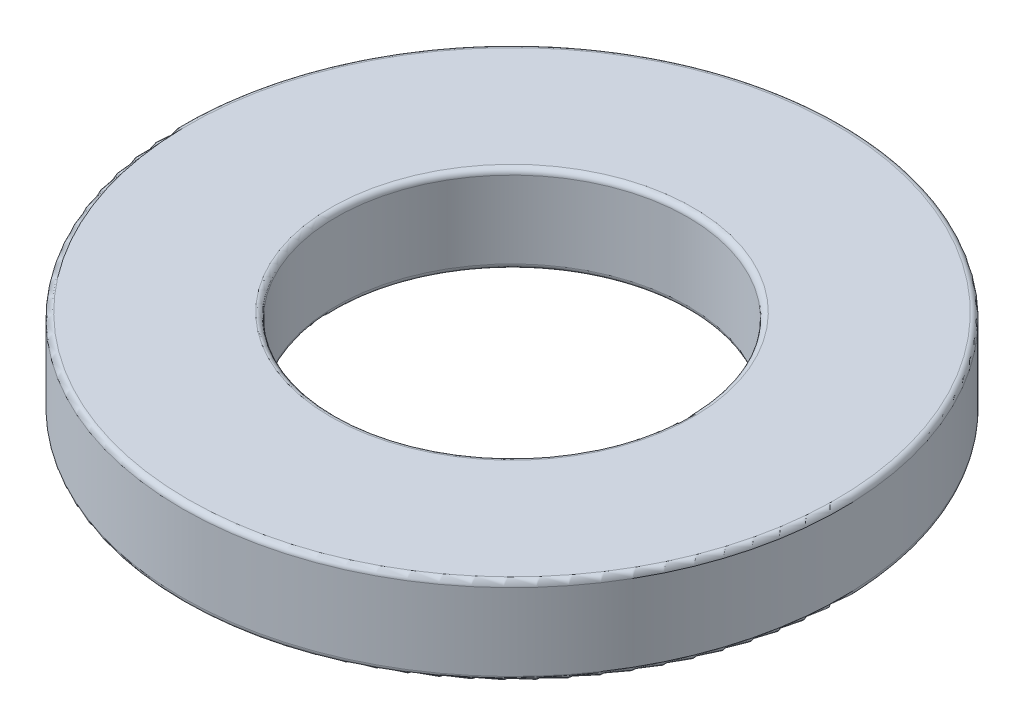
ISO-10303-21;
HEADER;
FILE_DESCRIPTION(('STEP AP214'),'2;1');
FILE_NAME('part.step','',(''),(''),'','','');
FILE_SCHEMA(('AUTOMOTIVE_DESIGN { 1 0 10303 214 1 1 1 1 }'));
ENDSEC;
DATA;
#1=APPLICATION_CONTEXT('core data for automotive mechanical design processes');
#2=APPLICATION_PROTOCOL_DEFINITION('international standard','automotive_design',2000,#1);
#3=PRODUCT_CONTEXT('',#1,'mechanical');
#4=PRODUCT('Part','Part','',(#3));
#5=PRODUCT_RELATED_PRODUCT_CATEGORY('part','',(#4));
#6=PRODUCT_DEFINITION_FORMATION('','',#4);
#7=PRODUCT_DEFINITION_CONTEXT('part definition',#1,'design');
#8=PRODUCT_DEFINITION('design','',#6,#7);
#9=PRODUCT_DEFINITION_SHAPE('','',#8);
#10=(LENGTH_UNIT() NAMED_UNIT(*) SI_UNIT(.MILLI.,.METRE.));
#11=(NAMED_UNIT(*) PLANE_ANGLE_UNIT() SI_UNIT($,.RADIAN.));
#12=(NAMED_UNIT(*) SI_UNIT($,.STERADIAN.) SOLID_ANGLE_UNIT());
#13=UNCERTAINTY_MEASURE_WITH_UNIT(LENGTH_MEASURE(1.E-05),#10,'distance_accuracy_value','');
#14=(GEOMETRIC_REPRESENTATION_CONTEXT(3) GLOBAL_UNCERTAINTY_ASSIGNED_CONTEXT((#13)) GLOBAL_UNIT_ASSIGNED_CONTEXT((#10,
#11,#12)) REPRESENTATION_CONTEXT('',''));
#15=CARTESIAN_POINT('',(0.,0.,0.));
#16=DIRECTION('',(0.,0.,1.));
#17=DIRECTION('',(1.,0.,0.));
#18=AXIS2_PLACEMENT_3D('',#15,#16,#17);
#19=CARTESIAN_POINT('',(0.,0.8,0.));
#20=DIRECTION('',(0.,1.,0.));
#21=DIRECTION('',(0.,0.,1.));
#22=AXIS2_PLACEMENT_3D('',#19,#20,#21);
#23=PLANE('',#22);
#24=CARTESIAN_POINT('',(0.,0.8,0.));
#25=DIRECTION('',(0.,1.,0.));
#26=DIRECTION('',(0.,0.,1.));
#27=AXIS2_PLACEMENT_3D('',#24,#25,#26);
#28=CIRCLE('',#27,3.3);
#29=CARTESIAN_POINT('',(0.,0.8,3.3));
#30=VERTEX_POINT('',#29);
#31=EDGE_CURVE('E10',#30,#30,#28,.F.);
#32=ORIENTED_EDGE('',*,*,#31,.T.);
#33=EDGE_LOOP('',(#32));
#34=FACE_BOUND('',#33,.T.);
#35=CARTESIAN_POINT('',(0.,0.8,0.));
#36=DIRECTION('',(0.,1.,0.));
#37=DIRECTION('',(0.,0.,1.));
#38=AXIS2_PLACEMENT_3D('',#35,#36,#37);
#39=CIRCLE('',#38,5.9);
#40=CARTESIAN_POINT('',(0.,0.8,5.9));
#41=VERTEX_POINT('',#40);
#42=EDGE_CURVE('E37',#41,#41,#39,.T.);
#43=ORIENTED_EDGE('',*,*,#42,.T.);
#44=EDGE_LOOP('',(#43));
#45=FACE_BOUND('',#44,.T.);
#46=ADVANCED_FACE('F30',(#34,#45),#23,.T.);
#47=CARTESIAN_POINT('',(0.,-0.8,0.));
#48=DIRECTION('',(0.,1.,0.));
#49=DIRECTION('',(0.,0.,1.));
#50=AXIS2_PLACEMENT_3D('',#47,#48,#49);
#51=PLANE('',#50);
#52=CARTESIAN_POINT('',(0.,-0.8,0.));
#53=DIRECTION('',(0.,1.,0.));
#54=DIRECTION('',(0.,0.,1.));
#55=AXIS2_PLACEMENT_3D('',#52,#53,#54);
#56=CIRCLE('',#55,3.3);
#57=CARTESIAN_POINT('',(0.,-0.8,3.3));
#58=VERTEX_POINT('',#57);
#59=EDGE_CURVE('E56',#58,#58,#56,.T.);
#60=ORIENTED_EDGE('',*,*,#59,.T.);
#61=EDGE_LOOP('',(#60));
#62=FACE_BOUND('',#61,.T.);
#63=CARTESIAN_POINT('',(0.,-0.8,0.));
#64=DIRECTION('',(0.,1.,0.));
#65=DIRECTION('',(0.,0.,1.));
#66=AXIS2_PLACEMENT_3D('',#63,#64,#65);
#67=CIRCLE('',#66,5.9);
#68=CARTESIAN_POINT('',(0.,-0.8,5.9));
#69=VERTEX_POINT('',#68);
#70=EDGE_CURVE('E59',#69,#69,#67,.F.);
#71=ORIENTED_EDGE('',*,*,#70,.T.);
#72=EDGE_LOOP('',(#71));
#73=FACE_BOUND('',#72,.T.);
#74=ADVANCED_FACE('F63',(#62,#73),#51,.F.);
#75=CARTESIAN_POINT('',(0.,0.8,0.));
#76=DIRECTION('',(0.,-1.,0.));
#77=DIRECTION('',(0.,0.,-1.));
#78=AXIS2_PLACEMENT_3D('',#75,#76,#77);
#79=CYLINDRICAL_SURFACE('',#78,6.);
#80=CARTESIAN_POINT('',(0.,-0.7,0.));
#81=DIRECTION('',(0.,1.,0.));
#82=DIRECTION('',(0.,0.,1.));
#83=AXIS2_PLACEMENT_3D('',#80,#81,#82);
#84=CIRCLE('',#83,6.);
#85=CARTESIAN_POINT('',(0.,-0.7,6.));
#86=VERTEX_POINT('',#85);
#87=EDGE_CURVE('E41',#86,#86,#84,.T.);
#88=ORIENTED_EDGE('',*,*,#87,.T.);
#89=EDGE_LOOP('',(#88));
#90=FACE_BOUND('',#89,.T.);
#91=CARTESIAN_POINT('',(0.,0.7,0.));
#92=DIRECTION('',(0.,1.,0.));
#93=DIRECTION('',(0.,0.,1.));
#94=AXIS2_PLACEMENT_3D('',#91,#92,#93);
#95=CIRCLE('',#94,6.);
#96=CARTESIAN_POINT('',(0.,0.7,6.));
#97=VERTEX_POINT('',#96);
#98=EDGE_CURVE('E45',#97,#97,#95,.F.);
#99=ORIENTED_EDGE('',*,*,#98,.T.);
#100=EDGE_LOOP('',(#99));
#101=FACE_BOUND('',#100,.T.);
#102=ADVANCED_FACE('F73',(#90,#101),#79,.T.);
#103=CARTESIAN_POINT('',(0.,0.8,0.));
#104=DIRECTION('',(0.,-1.,0.));
#105=DIRECTION('',(0.,0.,-1.));
#106=AXIS2_PLACEMENT_3D('',#103,#104,#105);
#107=CYLINDRICAL_SURFACE('',#106,3.2);
#108=CARTESIAN_POINT('',(0.,-0.7,0.));
#109=DIRECTION('',(0.,1.,0.));
#110=DIRECTION('',(0.,0.,1.));
#111=AXIS2_PLACEMENT_3D('',#108,#109,#110);
#112=CIRCLE('',#111,3.2);
#113=CARTESIAN_POINT('',(0.,-0.7,3.2));
#114=VERTEX_POINT('',#113);
#115=EDGE_CURVE('E50',#114,#114,#112,.F.);
#116=ORIENTED_EDGE('',*,*,#115,.T.);
#117=EDGE_LOOP('',(#116));
#118=FACE_BOUND('',#117,.T.);
#119=CARTESIAN_POINT('',(0.,0.7,0.));
#120=DIRECTION('',(0.,1.,0.));
#121=DIRECTION('',(0.,0.,1.));
#122=AXIS2_PLACEMENT_3D('',#119,#120,#121);
#123=CIRCLE('',#122,3.2);
#124=CARTESIAN_POINT('',(0.,0.7,3.2));
#125=VERTEX_POINT('',#124);
#126=EDGE_CURVE('E53',#125,#125,#123,.T.);
#127=ORIENTED_EDGE('',*,*,#126,.T.);
#128=EDGE_LOOP('',(#127));
#129=FACE_BOUND('',#128,.T.);
#130=ADVANCED_FACE('F76',(#118,#129),#107,.F.);
#131=CARTESIAN_POINT('',(0.,-0.7,0.));
#132=DIRECTION('',(0.,1.,0.));
#133=DIRECTION('',(0.,0.,1.));
#134=AXIS2_PLACEMENT_3D('',#131,#132,#133);
#135=TOROIDAL_SURFACE('',#134,3.3,0.1);
#136=ORIENTED_EDGE('',*,*,#115,.F.);
#137=EDGE_LOOP('',(#136));
#138=FACE_BOUND('',#137,.T.);
#139=ORIENTED_EDGE('',*,*,#59,.F.);
#140=EDGE_LOOP('',(#139));
#141=FACE_BOUND('',#140,.T.);
#142=ADVANCED_FACE('F69',(#138,#141),#135,.T.);
#143=CARTESIAN_POINT('',(0.,-0.7,0.));
#144=DIRECTION('',(0.,1.,0.));
#145=DIRECTION('',(0.,0.,1.));
#146=AXIS2_PLACEMENT_3D('',#143,#144,#145);
#147=TOROIDAL_SURFACE('',#146,5.9,0.1);
#148=ORIENTED_EDGE('',*,*,#70,.F.);
#149=EDGE_LOOP('',(#148));
#150=FACE_BOUND('',#149,.T.);
#151=ORIENTED_EDGE('',*,*,#87,.F.);
#152=EDGE_LOOP('',(#151));
#153=FACE_BOUND('',#152,.T.);
#154=ADVANCED_FACE('F65',(#150,#153),#147,.T.);
#155=CARTESIAN_POINT('',(0.,0.7,0.));
#156=DIRECTION('',(0.,1.,0.));
#157=DIRECTION('',(0.,0.,1.));
#158=AXIS2_PLACEMENT_3D('',#155,#156,#157);
#159=TOROIDAL_SURFACE('',#158,3.3,0.1);
#160=ORIENTED_EDGE('',*,*,#31,.F.);
#161=EDGE_LOOP('',(#160));
#162=FACE_BOUND('',#161,.T.);
#163=ORIENTED_EDGE('',*,*,#126,.F.);
#164=EDGE_LOOP('',(#163));
#165=FACE_BOUND('',#164,.T.);
#166=ADVANCED_FACE('F68',(#162,#165),#159,.T.);
#167=CARTESIAN_POINT('',(0.,0.7,0.));
#168=DIRECTION('',(0.,1.,0.));
#169=DIRECTION('',(0.,0.,1.));
#170=AXIS2_PLACEMENT_3D('',#167,#168,#169);
#171=TOROIDAL_SURFACE('',#170,5.9,0.1);
#172=ORIENTED_EDGE('',*,*,#98,.F.);
#173=EDGE_LOOP('',(#172));
#174=FACE_BOUND('',#173,.T.);
#175=ORIENTED_EDGE('',*,*,#42,.F.);
#176=EDGE_LOOP('',(#175));
#177=FACE_BOUND('',#176,.T.);
#178=ADVANCED_FACE('F32',(#174,#177),#171,.T.);
#179=CLOSED_SHELL('',(#46,#74,#102,#130,#142,#154,#166,#178));
#180=MANIFOLD_SOLID_BREP('B2',#179);
#181=ADVANCED_BREP_SHAPE_REPRESENTATION('',(#18,#180),#14);
#182=SHAPE_DEFINITION_REPRESENTATION(#9,#181);
ENDSEC;
END-ISO-10303-21;
